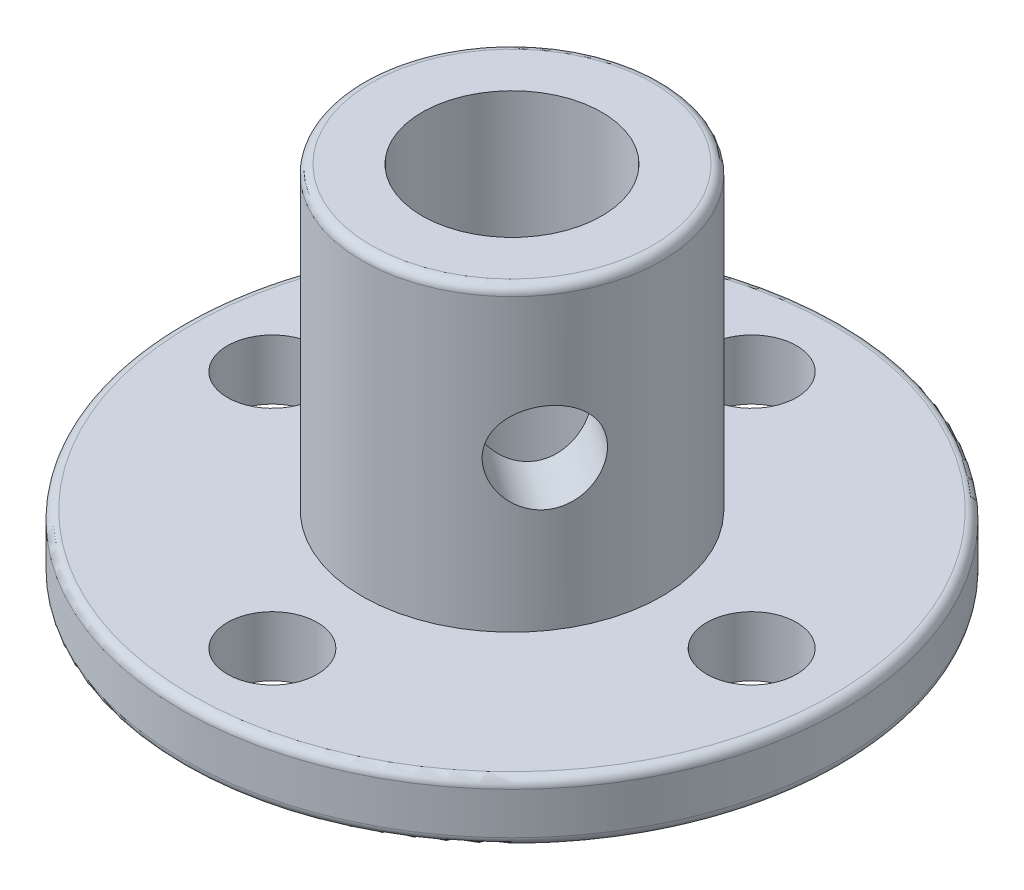
ISO-10303-21;
HEADER;
FILE_DESCRIPTION(('STEP AP214'),'2;1');
FILE_NAME('part.step','',(''),(''),'','','');
FILE_SCHEMA(('AUTOMOTIVE_DESIGN { 1 0 10303 214 1 1 1 1 }'));
ENDSEC;
DATA;
#1=APPLICATION_CONTEXT('core data for automotive mechanical design processes');
#2=APPLICATION_PROTOCOL_DEFINITION('international standard','automotive_design',2000,#1);
#3=PRODUCT_CONTEXT('',#1,'mechanical');
#4=PRODUCT('Part','Part','',(#3));
#5=PRODUCT_RELATED_PRODUCT_CATEGORY('part','',(#4));
#6=PRODUCT_DEFINITION_FORMATION('','',#4);
#7=PRODUCT_DEFINITION_CONTEXT('part definition',#1,'design');
#8=PRODUCT_DEFINITION('design','',#6,#7);
#9=PRODUCT_DEFINITION_SHAPE('','',#8);
#10=(LENGTH_UNIT() NAMED_UNIT(*) SI_UNIT(.MILLI.,.METRE.));
#11=(NAMED_UNIT(*) PLANE_ANGLE_UNIT() SI_UNIT($,.RADIAN.));
#12=(NAMED_UNIT(*) SI_UNIT($,.STERADIAN.) SOLID_ANGLE_UNIT());
#13=UNCERTAINTY_MEASURE_WITH_UNIT(LENGTH_MEASURE(1.E-05),#10,'distance_accuracy_value','');
#14=(GEOMETRIC_REPRESENTATION_CONTEXT(3) GLOBAL_UNCERTAINTY_ASSIGNED_CONTEXT((#13)) GLOBAL_UNIT_ASSIGNED_CONTEXT((#10,
#11,#12)) REPRESENTATION_CONTEXT('',''));
#15=CARTESIAN_POINT('',(0.,0.,0.));
#16=DIRECTION('',(0.,0.,1.));
#17=DIRECTION('',(1.,0.,0.));
#18=AXIS2_PLACEMENT_3D('',#15,#16,#17);
#19=CARTESIAN_POINT('',(0.,12.,0.));
#20=DIRECTION('',(0.,-1.,0.));
#21=DIRECTION('',(0.,0.,-1.));
#22=AXIS2_PLACEMENT_3D('',#19,#20,#21);
#23=CYLINDRICAL_SURFACE('',#22,5.);
#24=CARTESIAN_POINT('',(4.74981979198346,7.,1.56179766413009));
#25=CARTESIAN_POINT('',(4.7498198860034,6.9178054520576,1.56179899148066));
#26=CARTESIAN_POINT('',(4.74761311037452,6.83560077585598,1.56855767470248));
#27=CARTESIAN_POINT('',(4.73871476366398,6.67359475040806,1.59523490105232));
#28=CARTESIAN_POINT('',(4.73202169407674,6.59379421349853,1.61515784125528));
#29=CARTESIAN_POINT('',(4.71396580259608,6.43896527172827,1.6671157969936));
#30=CARTESIAN_POINT('',(4.70261074537588,6.36392917036691,1.69913066601295));
#31=CARTESIAN_POINT('',(4.67494093324864,6.2203780660047,1.7738398944877));
#32=CARTESIAN_POINT('',(4.65862543580988,6.15186404131556,1.81653585263303));
#33=CARTESIAN_POINT('',(4.62016354311629,6.02113360942262,1.91228123009578));
#34=CARTESIAN_POINT('',(4.59786337213556,5.95915410205371,1.9655924121608));
#35=CARTESIAN_POINT('',(4.54736337883399,5.84536204867749,2.07975400963413));
#36=CARTESIAN_POINT('',(4.51916279912231,5.79355080955012,2.14060539251168));
#37=CARTESIAN_POINT('',(4.45607507024332,5.70053730016669,2.26905525111366));
#38=CARTESIAN_POINT('',(4.42106170554921,5.65957657555719,2.33676723102905));
#39=CARTESIAN_POINT('',(4.34492921628019,5.59101274095724,2.47544672562874));
#40=CARTESIAN_POINT('',(4.30381141103157,5.56340675014255,2.54641353457629));
#41=CARTESIAN_POINT('',(4.21737774476952,5.52311999890949,2.68706916872544));
#42=CARTESIAN_POINT('',(4.17221562266321,5.5100348723473,2.75673647850275));
#43=CARTESIAN_POINT('',(4.07783344884419,5.49788267535356,2.8945191625187));
#44=CARTESIAN_POINT('',(4.02861425161109,5.49881266059804,2.96263485971201));
#45=CARTESIAN_POINT('',(3.92925268452518,5.51439286854302,3.09313597611797));
#46=CARTESIAN_POINT('',(3.87918963631798,5.52860519380987,3.15563480300084));
#47=CARTESIAN_POINT('',(3.77834151484289,5.56963133599429,3.27571160892614));
#48=CARTESIAN_POINT('',(3.72755639604793,5.59644595094267,3.33328927606678));
#49=CARTESIAN_POINT('',(3.62647744940709,5.66221202341856,3.44300669382439));
#50=CARTESIAN_POINT('',(3.57619623298301,5.70130120280727,3.49507529756695));
#51=CARTESIAN_POINT('',(3.47862209529838,5.79039785242823,3.59220474198665));
#52=CARTESIAN_POINT('',(3.43132988643211,5.84040791296349,3.63726391576127));
#53=CARTESIAN_POINT('',(3.3398800712971,5.9521977507516,3.72145347087077));
#54=CARTESIAN_POINT('',(3.29591357519374,6.01435691902974,3.76028834834377));
#55=CARTESIAN_POINT('',(3.21526473803641,6.14751001789005,3.82947824723582));
#56=CARTESIAN_POINT('',(3.17858312092933,6.21850482538923,3.85983242599325));
#57=CARTESIAN_POINT('',(3.11410027302203,6.36823946924899,3.91204868534414));
#58=CARTESIAN_POINT('',(3.086387570684,6.44704704586292,3.93382654265679));
#59=CARTESIAN_POINT('',(3.04200348954128,6.60960720844555,3.96825059140881));
#60=CARTESIAN_POINT('',(3.02532850884638,6.69335817153456,3.98089976189336));
#61=CARTESIAN_POINT('',(3.00451404052242,6.86008236073928,3.9966311208788));
#62=CARTESIAN_POINT('',(2.99993048712393,6.94296822389398,4.00005232362724));
#63=CARTESIAN_POINT('',(3.00231176632737,7.10847290000987,3.99826549518246));
#64=CARTESIAN_POINT('',(3.00927498237146,7.19109174873085,3.9930586719205));
#65=CARTESIAN_POINT('',(3.03396504078735,7.35148837797087,3.97432801085477));
#66=CARTESIAN_POINT('',(3.05140755900535,7.42933616426353,3.96102375210047));
#67=CARTESIAN_POINT('',(3.09580233380296,7.58040169081492,3.92642263696043));
#68=CARTESIAN_POINT('',(3.12275605867499,7.65361871414057,3.90512454649467));
#69=CARTESIAN_POINT('',(3.18560655575352,7.79551746407213,3.8540353269966));
#70=CARTESIAN_POINT('',(3.22172394036167,7.86402472098579,3.82403158952298));
#71=CARTESIAN_POINT('',(3.30075952196178,7.9926381061808,3.75602180619148));
#72=CARTESIAN_POINT('',(3.34367934635984,8.05274221761279,3.71801384469722));
#73=CARTESIAN_POINT('',(3.43616698910292,8.16518040581474,3.63274723976687));
#74=CARTESIAN_POINT('',(3.48592457329904,8.21713562898698,3.5851936076426));
#75=CARTESIAN_POINT('',(3.58859032033034,8.30896670102775,3.4824254413391));
#76=CARTESIAN_POINT('',(3.64149832654548,8.34884314978146,3.42721128781378));
#77=CARTESIAN_POINT('',(3.74787820699985,8.4150000305683,3.3105268274446));
#78=CARTESIAN_POINT('',(3.80134268426911,8.44138201615898,3.24910754457441));
#79=CARTESIAN_POINT('',(3.90713801311733,8.48006091889042,3.12108282501145));
#80=CARTESIAN_POINT('',(3.95946918483369,8.49236186594842,3.0544788779725));
#81=CARTESIAN_POINT('',(4.05916272311246,8.5022230440545,2.92059875528922));
#82=CARTESIAN_POINT('',(4.10663883003786,8.50033269540783,2.85344724127037));
#83=CARTESIAN_POINT('',(4.1974628745514,8.48317836750088,2.71807812258277));
#84=CARTESIAN_POINT('',(4.24081104605043,8.46791514651956,2.64986057857629));
#85=CARTESIAN_POINT('',(4.32200535123502,8.42478833860037,2.51523147475257));
#86=CARTESIAN_POINT('',(4.35990556933865,8.39706181935099,2.44880838794386));
#87=CARTESIAN_POINT('',(4.43027713418244,8.32991808549281,2.31907248743974));
#88=CARTESIAN_POINT('',(4.4627475874061,8.29049894971381,2.25576018686022));
#89=CARTESIAN_POINT('',(4.52308013041892,8.19962654256996,2.13228096809081));
#90=CARTESIAN_POINT('',(4.55076152106797,8.14782856999923,2.07227951430628));
#91=CARTESIAN_POINT('',(4.6003493598831,8.0342896116672,1.95973854728669));
#92=CARTESIAN_POINT('',(4.62225413993366,7.97254576210185,1.90720119147979));
#93=CARTESIAN_POINT('',(4.66115320262134,7.83865922168949,1.81010304940294));
#94=CARTESIAN_POINT('',(4.67798167257045,7.76626144660956,1.76582666939937));
#95=CARTESIAN_POINT('',(4.70619188731925,7.61444482583898,1.68921118961477));
#96=CARTESIAN_POINT('',(4.71757624991194,7.53502937639881,1.65686635427766));
#97=CARTESIAN_POINT('',(4.73427994530234,7.38025956839373,1.60847021446135));
#98=CARTESIAN_POINT('',(4.74012108377458,7.30539135306901,1.59103758954651));
#99=CARTESIAN_POINT('',(4.74789057095865,7.15368477750423,1.56770184956096));
#100=CARTESIAN_POINT('',(4.74981970408063,7.07684681535475,1.56179642313946));
#101=CARTESIAN_POINT('',(4.74981979198346,7.,1.56179766413009));
#102=B_SPLINE_CURVE_WITH_KNOTS('',3,(#24,#25,#26,#27,#28,#29,#30,#31,#32,#33,#34,#35,#36,#37,
#38,#39,#40,#41,#42,#43,#44,#45,#46,#47,#48,#49,#50,#51,#52,#53,#54,#55,#56,#57,#58,#59,#60,#61,
#62,#63,#64,#65,#66,#67,#68,#69,#70,#71,#72,#73,#74,#75,#76,#77,#78,#79,#80,#81,#82,#83,#84,#85,
#86,#87,#88,#89,#90,#91,#92,#93,#94,#95,#96,#97,#98,#99,#100,#101),.UNSPECIFIED.,.T.,.F.,(4,2,2,
2,2,2,2,2,2,2,2,2,2,2,2,2,2,2,2,2,2,2,2,2,2,2,2,2,2,2,2,2,2,2,2,2,2,2,4),(0.,0.246300165915543,
0.492682641689001,0.738656414466194,0.984667025370102,1.23773150007984,1.49082847871273,
1.74915939273645,2.00743455587877,2.25832140149558,2.50915554101441,2.7520012599088,
2.99486235890376,3.24055209335676,3.48630016590831,3.74152147023278,3.99676812491863,
4.25446238246267,4.51207250628411,4.76008080790309,5.00805439107388,5.24958594938817,
5.49115481045788,5.73920731809389,5.98731925928923,6.24479506100602,6.50225807324202,
6.75775391814325,7.01317662321682,7.2587630391122,7.50433553047755,7.74727096872219,
7.99024634491378,8.24099627054488,8.49181852629891,8.75011639669147,9.00828993963944,
9.23861153857448,9.4688869503356),.UNSPECIFIED.);
#103=CARTESIAN_POINT('',(4.74981979198346,7.,1.56179766413009));
#104=VERTEX_POINT('',#103);
#105=EDGE_CURVE('E92',#104,#104,#102,.T.);
#106=ORIENTED_EDGE('',*,*,#105,.T.);
#107=EDGE_LOOP('',(#106));
#108=FACE_BOUND('',#107,.T.);
#109=CARTESIAN_POINT('',(0.,11.7,0.));
#110=DIRECTION('',(0.,1.,0.));
#111=DIRECTION('',(0.,0.,1.));
#112=AXIS2_PLACEMENT_3D('',#109,#110,#111);
#113=CIRCLE('',#112,5.);
#114=CARTESIAN_POINT('',(0.,11.7,5.));
#115=VERTEX_POINT('',#114);
#116=EDGE_CURVE('E66',#115,#115,#113,.F.);
#117=ORIENTED_EDGE('',*,*,#116,.T.);
#118=EDGE_LOOP('',(#117));
#119=FACE_BOUND('',#118,.T.);
#120=CARTESIAN_POINT('',(0.,2.,0.));
#121=DIRECTION('',(0.,1.,0.));
#122=DIRECTION('',(0.,0.,1.));
#123=AXIS2_PLACEMENT_3D('',#120,#121,#122);
#124=CIRCLE('',#123,5.);
#125=CARTESIAN_POINT('',(0.,2.,5.));
#126=VERTEX_POINT('',#125);
#127=EDGE_CURVE('E74',#126,#126,#124,.T.);
#128=ORIENTED_EDGE('',*,*,#127,.T.);
#129=EDGE_LOOP('',(#128));
#130=FACE_BOUND('',#129,.T.);
#131=ADVANCED_FACE('F37',(#108,#119,#130),#23,.T.);
#132=CARTESIAN_POINT('',(0.,12.,0.));
#133=DIRECTION('',(0.,1.,0.));
#134=DIRECTION('',(0.,0.,1.));
#135=AXIS2_PLACEMENT_3D('',#132,#133,#134);
#136=PLANE('',#135);
#137=CARTESIAN_POINT('',(0.,12.,0.));
#138=DIRECTION('',(0.,1.,0.));
#139=DIRECTION('',(0.,0.,1.));
#140=AXIS2_PLACEMENT_3D('',#137,#138,#139);
#141=CIRCLE('',#140,4.7);
#142=CARTESIAN_POINT('',(0.,12.,4.7));
#143=VERTEX_POINT('',#142);
#144=EDGE_CURVE('E70',#143,#143,#141,.T.);
#145=ORIENTED_EDGE('',*,*,#144,.T.);
#146=EDGE_LOOP('',(#145));
#147=FACE_BOUND('',#146,.T.);
#148=CARTESIAN_POINT('',(0.,12.,0.));
#149=DIRECTION('',(0.,1.,0.));
#150=DIRECTION('',(0.,0.,1.));
#151=AXIS2_PLACEMENT_3D('',#148,#149,#150);
#152=CIRCLE('',#151,3.);
#153=CARTESIAN_POINT('',(0.,12.,3.));
#154=VERTEX_POINT('',#153);
#155=EDGE_CURVE('E78',#154,#154,#152,.T.);
#156=ORIENTED_EDGE('',*,*,#155,.F.);
#157=EDGE_LOOP('',(#156));
#158=FACE_BOUND('',#157,.T.);
#159=ADVANCED_FACE('F162',(#147,#158),#136,.T.);
#160=CARTESIAN_POINT('',(0.,2.,0.));
#161=DIRECTION('',(0.,-1.,0.));
#162=DIRECTION('',(0.,0.,-1.));
#163=AXIS2_PLACEMENT_3D('',#160,#161,#162);
#164=CYLINDRICAL_SURFACE('',#163,11.);
#165=CARTESIAN_POINT('',(0.,0.3,0.));
#166=DIRECTION('',(0.,1.,0.));
#167=DIRECTION('',(0.,0.,1.));
#168=AXIS2_PLACEMENT_3D('',#165,#166,#167);
#169=CIRCLE('',#168,11.);
#170=CARTESIAN_POINT('',(0.,0.3,11.));
#171=VERTEX_POINT('',#170);
#172=EDGE_CURVE('E56',#171,#171,#169,.T.);
#173=ORIENTED_EDGE('',*,*,#172,.T.);
#174=EDGE_LOOP('',(#173));
#175=FACE_BOUND('',#174,.T.);
#176=CARTESIAN_POINT('',(0.,1.7,0.));
#177=DIRECTION('',(0.,1.,0.));
#178=DIRECTION('',(0.,0.,1.));
#179=AXIS2_PLACEMENT_3D('',#176,#177,#178);
#180=CIRCLE('',#179,11.);
#181=CARTESIAN_POINT('',(0.,1.7,11.));
#182=VERTEX_POINT('',#181);
#183=EDGE_CURVE('E62',#182,#182,#180,.F.);
#184=ORIENTED_EDGE('',*,*,#183,.T.);
#185=EDGE_LOOP('',(#184));
#186=FACE_BOUND('',#185,.T.);
#187=ADVANCED_FACE('F159',(#175,#186),#164,.T.);
#188=CARTESIAN_POINT('',(0.,2.,0.));
#189=DIRECTION('',(0.,1.,0.));
#190=DIRECTION('',(0.,0.,1.));
#191=AXIS2_PLACEMENT_3D('',#188,#189,#190);
#192=PLANE('',#191);
#193=CARTESIAN_POINT('',(0.,2.,0.));
#194=DIRECTION('',(0.,1.,0.));
#195=DIRECTION('',(0.,0.,1.));
#196=AXIS2_PLACEMENT_3D('',#193,#194,#195);
#197=CIRCLE('',#196,10.7);
#198=CARTESIAN_POINT('',(0.,2.,10.7));
#199=VERTEX_POINT('',#198);
#200=EDGE_CURVE('E10',#199,#199,#197,.T.);
#201=ORIENTED_EDGE('',*,*,#200,.T.);
#202=EDGE_LOOP('',(#201));
#203=FACE_BOUND('',#202,.T.);
#204=CARTESIAN_POINT('',(0.,2.,-8.));
#205=DIRECTION('',(0.,1.,0.));
#206=DIRECTION('',(0.,0.,1.));
#207=AXIS2_PLACEMENT_3D('',#204,#205,#206);
#208=CIRCLE('',#207,1.5);
#209=CARTESIAN_POINT('',(0.,2.,-6.5));
#210=VERTEX_POINT('',#209);
#211=EDGE_CURVE('E112',#210,#210,#208,.T.);
#212=ORIENTED_EDGE('',*,*,#211,.F.);
#213=EDGE_LOOP('',(#212));
#214=FACE_BOUND('',#213,.T.);
#215=CARTESIAN_POINT('',(8.00000000000023,2.,-2.25904099284255E-13));
#216=DIRECTION('',(0.,1.,0.));
#217=DIRECTION('',(0.,0.,1.));
#218=AXIS2_PLACEMENT_3D('',#215,#216,#217);
#219=CIRCLE('',#218,1.50000000000018);
#220=CARTESIAN_POINT('',(8.00000000000023,2.,1.49999999999995));
#221=VERTEX_POINT('',#220);
#222=EDGE_CURVE('E104',#221,#221,#219,.T.);
#223=ORIENTED_EDGE('',*,*,#222,.F.);
#224=EDGE_LOOP('',(#223));
#225=FACE_BOUND('',#224,.T.);
#226=CARTESIAN_POINT('',(4.51808198568511E-13,2.,8.));
#227=DIRECTION('',(0.,1.,0.));
#228=DIRECTION('',(0.,0.,1.));
#229=AXIS2_PLACEMENT_3D('',#226,#227,#228);
#230=CIRCLE('',#229,1.50000000000049);
#231=CARTESIAN_POINT('',(4.51808198568511E-13,2.,9.50000000000048));
#232=VERTEX_POINT('',#231);
#233=EDGE_CURVE('E96',#232,#232,#230,.T.);
#234=ORIENTED_EDGE('',*,*,#233,.F.);
#235=EDGE_LOOP('',(#234));
#236=FACE_BOUND('',#235,.T.);
#237=CARTESIAN_POINT('',(-7.99999999999977,2.,2.26883816723573E-13));
#238=DIRECTION('',(0.,1.,0.));
#239=DIRECTION('',(0.,0.,1.));
#240=AXIS2_PLACEMENT_3D('',#237,#238,#239);
#241=CIRCLE('',#240,1.50000000000036);
#242=CARTESIAN_POINT('',(-7.99999999999977,2.,1.50000000000059));
#243=VERTEX_POINT('',#242);
#244=EDGE_CURVE('E87',#243,#243,#241,.T.);
#245=ORIENTED_EDGE('',*,*,#244,.F.);
#246=EDGE_LOOP('',(#245));
#247=FACE_BOUND('',#246,.T.);
#248=ORIENTED_EDGE('',*,*,#127,.F.);
#249=EDGE_LOOP('',(#248));
#250=FACE_BOUND('',#249,.T.);
#251=ADVANCED_FACE('F156',(#203,#214,#225,#236,#247,#250),#192,.T.);
#252=CARTESIAN_POINT('',(0.,0.,0.));
#253=DIRECTION('',(0.,1.,0.));
#254=DIRECTION('',(0.,0.,1.));
#255=AXIS2_PLACEMENT_3D('',#252,#253,#254);
#256=PLANE('',#255);
#257=CARTESIAN_POINT('',(0.,0.,0.));
#258=DIRECTION('',(0.,1.,0.));
#259=DIRECTION('',(0.,0.,1.));
#260=AXIS2_PLACEMENT_3D('',#257,#258,#259);
#261=CIRCLE('',#260,10.7);
#262=CARTESIAN_POINT('',(0.,0.,10.7));
#263=VERTEX_POINT('',#262);
#264=EDGE_CURVE('E51',#263,#263,#261,.F.);
#265=ORIENTED_EDGE('',*,*,#264,.T.);
#266=EDGE_LOOP('',(#265));
#267=FACE_BOUND('',#266,.T.);
#268=CARTESIAN_POINT('',(0.,0.,-8.));
#269=DIRECTION('',(0.,1.,0.));
#270=DIRECTION('',(0.,0.,1.));
#271=AXIS2_PLACEMENT_3D('',#268,#269,#270);
#272=CIRCLE('',#271,1.5);
#273=CARTESIAN_POINT('',(0.,0.,-6.5));
#274=VERTEX_POINT('',#273);
#275=EDGE_CURVE('E83',#274,#274,#272,.T.);
#276=ORIENTED_EDGE('',*,*,#275,.T.);
#277=EDGE_LOOP('',(#276));
#278=FACE_BOUND('',#277,.T.);
#279=CARTESIAN_POINT('',(8.00000000000023,0.,-2.25904099284255E-13));
#280=DIRECTION('',(0.,1.,0.));
#281=DIRECTION('',(0.,0.,1.));
#282=AXIS2_PLACEMENT_3D('',#279,#280,#281);
#283=CIRCLE('',#282,1.50000000000018);
#284=CARTESIAN_POINT('',(8.00000000000023,0.,1.49999999999995));
#285=VERTEX_POINT('',#284);
#286=EDGE_CURVE('E108',#285,#285,#283,.T.);
#287=ORIENTED_EDGE('',*,*,#286,.T.);
#288=EDGE_LOOP('',(#287));
#289=FACE_BOUND('',#288,.T.);
#290=CARTESIAN_POINT('',(4.51808198568511E-13,0.,8.));
#291=DIRECTION('',(0.,1.,0.));
#292=DIRECTION('',(0.,0.,1.));
#293=AXIS2_PLACEMENT_3D('',#290,#291,#292);
#294=CIRCLE('',#293,1.50000000000049);
#295=CARTESIAN_POINT('',(4.51808198568511E-13,0.,9.50000000000048));
#296=VERTEX_POINT('',#295);
#297=EDGE_CURVE('E100',#296,#296,#294,.T.);
#298=ORIENTED_EDGE('',*,*,#297,.T.);
#299=EDGE_LOOP('',(#298));
#300=FACE_BOUND('',#299,.T.);
#301=CARTESIAN_POINT('',(-7.99999999999977,0.,2.26883816723573E-13));
#302=DIRECTION('',(0.,1.,0.));
#303=DIRECTION('',(0.,0.,1.));
#304=AXIS2_PLACEMENT_3D('',#301,#302,#303);
#305=CIRCLE('',#304,1.50000000000036);
#306=CARTESIAN_POINT('',(-7.99999999999977,0.,1.50000000000059));
#307=VERTEX_POINT('',#306);
#308=EDGE_CURVE('E91',#307,#307,#305,.T.);
#309=ORIENTED_EDGE('',*,*,#308,.T.);
#310=EDGE_LOOP('',(#309));
#311=FACE_BOUND('',#310,.T.);
#312=CARTESIAN_POINT('',(0.,0.,0.));
#313=DIRECTION('',(0.,1.,0.));
#314=DIRECTION('',(0.,0.,1.));
#315=AXIS2_PLACEMENT_3D('',#312,#313,#314);
#316=CIRCLE('',#315,3.);
#317=CARTESIAN_POINT('',(0.,0.,3.));
#318=VERTEX_POINT('',#317);
#319=EDGE_CURVE('E79',#318,#318,#316,.T.);
#320=ORIENTED_EDGE('',*,*,#319,.T.);
#321=EDGE_LOOP('',(#320));
#322=FACE_BOUND('',#321,.T.);
#323=ADVANCED_FACE('F154',(#267,#278,#289,#300,#311,#322),#256,.F.);
#324=CARTESIAN_POINT('',(0.,12.,0.));
#325=DIRECTION('',(0.,-1.,0.));
#326=DIRECTION('',(0.,0.,-1.));
#327=AXIS2_PLACEMENT_3D('',#324,#325,#326);
#328=CYLINDRICAL_SURFACE('',#327,3.);
#329=CARTESIAN_POINT('',(2.98537870795165,7.,0.295827602006499));
#330=CARTESIAN_POINT('',(2.98538106045058,6.92183828770712,0.295836004226531));
#331=CARTESIAN_POINT('',(2.98470287628724,6.84357788271243,0.302911983875168));
#332=CARTESIAN_POINT('',(2.98175225480578,6.68945910298427,0.330659729647794));
#333=CARTESIAN_POINT('',(2.97947646684077,6.61360612743489,0.35136006436002));
#334=CARTESIAN_POINT('',(2.97269757298144,6.46682250348409,0.404698331122956));
#335=CARTESIAN_POINT('',(2.96820626814103,6.39586802128962,0.437272777758065));
#336=CARTESIAN_POINT('',(2.95614270862723,6.25986369700492,0.512510997642826));
#337=CARTESIAN_POINT('',(2.94857028726524,6.19481417460631,0.555175316702931));
#338=CARTESIAN_POINT('',(2.92860705293203,6.06654140716374,0.652633162115697));
#339=CARTESIAN_POINT('',(2.9158703411219,6.00391129648968,0.708136851834743));
#340=CARTESIAN_POINT('',(2.88450480231539,5.88788741738994,0.826675252992474));
#341=CARTESIAN_POINT('',(2.86587304930726,5.83449825612472,0.889713694626466));
#342=CARTESIAN_POINT('',(2.8202009096334,5.73494927327851,1.02564102831279));
#343=CARTESIAN_POINT('',(2.79267837777439,5.6895193482107,1.09890748204337));
#344=CARTESIAN_POINT('',(2.7289477964944,5.61228872013136,1.24878168273887));
#345=CARTESIAN_POINT('',(2.6927452510423,5.58047941579424,1.3253872872738));
#346=CARTESIAN_POINT('',(2.6145232316586,5.53374300804835,1.4733515823509));
#347=CARTESIAN_POINT('',(2.57310094956128,5.5177757104667,1.54469576359138));
#348=CARTESIAN_POINT('',(2.48356238258561,5.49975082198744,1.6848794350476));
#349=CARTESIAN_POINT('',(2.4354501660204,5.49768481480643,1.75372041566375));
#350=CARTESIAN_POINT('',(2.33856919326385,5.50712001095552,1.88066937643206));
#351=CARTESIAN_POINT('',(2.29022136290754,5.51745702328183,1.93919011904323));
#352=CARTESIAN_POINT('',(2.19093131619369,5.54932126585699,2.05070595318921));
#353=CARTESIAN_POINT('',(2.13998890595687,5.57084933346433,2.10370063088596));
#354=CARTESIAN_POINT('',(2.03660752833834,5.62462384913472,2.20397198437339));
#355=CARTESIAN_POINT('',(1.98415760679616,5.6570144697581,2.25115940492464));
#356=CARTESIAN_POINT('',(1.88030954877122,5.73139512430224,2.33860024114232));
#357=CARTESIAN_POINT('',(1.82891179603794,5.77338859495352,2.37885116526443));
#358=CARTESIAN_POINT('',(1.72425762148479,5.87034302729952,2.45592094479395));
#359=CARTESIAN_POINT('',(1.67128476545347,5.92615454248901,2.49205571644158));
#360=CARTESIAN_POINT('',(1.57112806761246,6.04688458739527,2.55638553190107));
#361=CARTESIAN_POINT('',(1.52394869001639,6.11181005841109,2.58457447438626));
#362=CARTESIAN_POINT('',(1.43517510441872,6.25397228863613,2.63496540291397));
#363=CARTESIAN_POINT('',(1.39412583834355,6.33172903458132,2.65667351549289));
#364=CARTESIAN_POINT('',(1.32469815011528,6.4944065070385,2.69197080685224));
#365=CARTESIAN_POINT('',(1.29630650985268,6.57931964952634,2.70556846026483));
#366=CARTESIAN_POINT('',(1.25671862196342,6.74682176692419,2.72417046267139));
#367=CARTESIAN_POINT('',(1.24433801052622,6.82906167856533,2.72977040194021));
#368=CARTESIAN_POINT('',(1.23410637448811,6.99460201227481,2.73441420502745));
#369=CARTESIAN_POINT('',(1.23624508643163,7.07790164367968,2.73346269994045));
#370=CARTESIAN_POINT('',(1.25375153220379,7.23348087786809,2.7254677553469));
#371=CARTESIAN_POINT('',(1.26764653745335,7.30596917666189,2.71910210471239));
#372=CARTESIAN_POINT('',(1.30557012143247,7.44755167940644,2.70109678724348));
#373=CARTESIAN_POINT('',(1.32960198180764,7.51664477611991,2.68945541238642));
#374=CARTESIAN_POINT('',(1.38747187866889,7.65311699635404,2.66007832802786));
#375=CARTESIAN_POINT('',(1.42171253960093,7.72026852528033,2.6420853300009));
#376=CARTESIAN_POINT('',(1.49748777017849,7.84820390730849,2.5998865843229));
#377=CARTESIAN_POINT('',(1.53902608482438,7.90898446526993,2.57567764382463));
#378=CARTESIAN_POINT('',(1.63305930683261,8.03046815128532,2.51725039875181));
#379=CARTESIAN_POINT('',(1.68627530929992,8.09019572607649,2.48215504102022));
#380=CARTESIAN_POINT('',(1.7969313840196,8.19911835699039,2.40325908005385));
#381=CARTESIAN_POINT('',(1.85437287434403,8.24830985534581,2.35945554588459));
#382=CARTESIAN_POINT('',(1.97244786412444,8.33586058892515,2.26173981481177));
#383=CARTESIAN_POINT('',(2.03312559690025,8.37389967731636,2.20759134204642));
#384=CARTESIAN_POINT('',(2.15328628415974,8.43570685578609,2.09054262565844));
#385=CARTESIAN_POINT('',(2.21277024322522,8.45948747704946,2.02765012687447));
#386=CARTESIAN_POINT('',(2.32241141573519,8.49005284626199,1.90073261290088));
#387=CARTESIAN_POINT('',(2.37292361400552,8.49819681381417,1.8373409741742));
#388=CARTESIAN_POINT('',(2.46872909384511,8.5012648981816,1.7064421826809));
#389=CARTESIAN_POINT('',(2.51402419656863,8.49619364278534,1.63893647868841));
#390=CARTESIAN_POINT('',(2.5953085111306,8.47387538980656,1.50665495595461));
#391=CARTESIAN_POINT('',(2.63171425470613,8.45745272611349,1.44199236812228));
#392=CARTESIAN_POINT('',(2.69835548270555,8.41400950104554,1.31306781190515));
#393=CARTESIAN_POINT('',(2.7285900813264,8.38698741985982,1.2488059023151));
#394=CARTESIAN_POINT('',(2.78407737356368,8.32190942175104,1.11984486357522));
#395=CARTESIAN_POINT('',(2.80906168095463,8.28343101518824,1.05524458899756));
#396=CARTESIAN_POINT('',(2.85285184071873,8.19706310371142,0.930387622857529));
#397=CARTESIAN_POINT('',(2.87165484471863,8.14916927632649,0.870132943720809));
#398=CARTESIAN_POINT('',(2.90546365022056,8.03980429146594,0.750032668523973));
#399=CARTESIAN_POINT('',(2.91990532332379,7.97745626878421,0.690824563140698));
#400=CARTESIAN_POINT('',(2.94351154594498,7.84382391830535,0.582102233746068));
#401=CARTESIAN_POINT('',(2.95267143671982,7.77253176869847,0.532596593020886));
#402=CARTESIAN_POINT('',(2.96723805287054,7.62004503012857,0.444477549616608));
#403=CARTESIAN_POINT('',(2.97251702328007,7.5386087033069,0.406257802679138));
#404=CARTESIAN_POINT('',(2.98015819320242,7.37000139349033,0.34584431369325));
#405=CARTESIAN_POINT('',(2.98253016479313,7.28285066663097,0.323596984314427));
#406=CARTESIAN_POINT('',(2.98440407235656,7.16229196652201,0.305527680131114));
#407=CARTESIAN_POINT('',(2.98477191740748,7.12994815840318,0.301897887810828));
#408=CARTESIAN_POINT('',(2.98525875374377,7.06507527897664,0.297046018889185));
#409=CARTESIAN_POINT('',(2.98537772838138,7.03254619542119,0.295824103358796));
#410=CARTESIAN_POINT('',(2.98537870795165,7.,0.295827602006499));
#411=B_SPLINE_CURVE_WITH_KNOTS('',3,(#329,#330,#331,#332,#333,#334,#335,#336,#337,#338,#339,
#340,#341,#342,#343,#344,#345,#346,#347,#348,#349,#350,#351,#352,#353,#354,#355,#356,#357,#358,
#359,#360,#361,#362,#363,#364,#365,#366,#367,#368,#369,#370,#371,#372,#373,#374,#375,#376,#377,
#378,#379,#380,#381,#382,#383,#384,#385,#386,#387,#388,#389,#390,#391,#392,#393,#394,#395,#396,
#397,#398,#399,#400,#401,#402,#403,#404,#405,#406,#407,#408,#409,#410),.UNSPECIFIED.,.T.,.F.,(4,
2,2,2,2,2,2,2,2,2,2,2,2,2,2,2,2,2,2,2,2,2,2,2,2,2,2,2,2,2,2,2,2,2,2,2,2,2,2,2,4),(0.,
0.234348183892072,0.469189339237207,0.702792893878328,0.936409088167724,1.18929346874735,
1.44230356626556,1.71236838358145,1.98226240445837,2.23295227451903,2.4834903552906,
2.71224146226808,2.94100968776183,3.1729430209672,3.40495949025408,3.65890787185336,
3.91305072368878,4.18333262594173,4.45333161317557,4.70193436281318,4.9503613978256,
5.17161275136038,5.39293578654095,5.62450944609132,5.85620229330071,6.1171011537092,
6.37808797467304,6.64596272119449,6.91360169713158,7.1566840558423,7.39968130190958,
7.62666637307239,7.8536840026802,8.09041126079208,8.32724745151079,8.58765362775102,
8.84828914267732,9.11716123557908,9.38512699504141,9.48270202777964,9.58028358741811),.UNSPECIFIED.);
#412=CARTESIAN_POINT('',(2.98537870795165,7.,0.295827602006499));
#413=VERTEX_POINT('',#412);
#414=EDGE_CURVE('E41',#413,#413,#411,.T.);
#415=ORIENTED_EDGE('',*,*,#414,.F.);
#416=EDGE_LOOP('',(#415));
#417=FACE_BOUND('',#416,.T.);
#418=ORIENTED_EDGE('',*,*,#155,.T.);
#419=EDGE_LOOP('',(#418));
#420=FACE_BOUND('',#419,.T.);
#421=ORIENTED_EDGE('',*,*,#319,.F.);
#422=EDGE_LOOP('',(#421));
#423=FACE_BOUND('',#422,.T.);
#424=ADVANCED_FACE('F149',(#417,#420,#423),#328,.F.);
#425=CARTESIAN_POINT('',(-7.99999999999977,0.,2.26883816723573E-13));
#426=DIRECTION('',(0.,1.,0.));
#427=DIRECTION('',(0.,0.,1.));
#428=AXIS2_PLACEMENT_3D('',#425,#426,#427);
#429=CYLINDRICAL_SURFACE('',#428,1.50000000000036);
#430=ORIENTED_EDGE('',*,*,#308,.F.);
#431=EDGE_LOOP('',(#430));
#432=FACE_BOUND('',#431,.T.);
#433=ORIENTED_EDGE('',*,*,#244,.T.);
#434=EDGE_LOOP('',(#433));
#435=FACE_BOUND('',#434,.T.);
#436=ADVANCED_FACE('F146',(#432,#435),#429,.F.);
#437=CARTESIAN_POINT('',(4.51808198568511E-13,0.,8.));
#438=DIRECTION('',(0.,1.,0.));
#439=DIRECTION('',(0.,0.,1.));
#440=AXIS2_PLACEMENT_3D('',#437,#438,#439);
#441=CYLINDRICAL_SURFACE('',#440,1.50000000000049);
#442=ORIENTED_EDGE('',*,*,#297,.F.);
#443=EDGE_LOOP('',(#442));
#444=FACE_BOUND('',#443,.T.);
#445=ORIENTED_EDGE('',*,*,#233,.T.);
#446=EDGE_LOOP('',(#445));
#447=FACE_BOUND('',#446,.T.);
#448=ADVANCED_FACE('F142',(#444,#447),#441,.F.);
#449=CARTESIAN_POINT('',(8.00000000000023,0.,-2.25904099284255E-13));
#450=DIRECTION('',(0.,1.,0.));
#451=DIRECTION('',(0.,0.,1.));
#452=AXIS2_PLACEMENT_3D('',#449,#450,#451);
#453=CYLINDRICAL_SURFACE('',#452,1.50000000000018);
#454=ORIENTED_EDGE('',*,*,#286,.F.);
#455=EDGE_LOOP('',(#454));
#456=FACE_BOUND('',#455,.T.);
#457=ORIENTED_EDGE('',*,*,#222,.T.);
#458=EDGE_LOOP('',(#457));
#459=FACE_BOUND('',#458,.T.);
#460=ADVANCED_FACE('F138',(#456,#459),#453,.F.);
#461=CARTESIAN_POINT('',(0.,0.,-8.));
#462=DIRECTION('',(0.,1.,0.));
#463=DIRECTION('',(0.,0.,1.));
#464=AXIS2_PLACEMENT_3D('',#461,#462,#463);
#465=CYLINDRICAL_SURFACE('',#464,1.5);
#466=ORIENTED_EDGE('',*,*,#275,.F.);
#467=EDGE_LOOP('',(#466));
#468=FACE_BOUND('',#467,.T.);
#469=ORIENTED_EDGE('',*,*,#211,.T.);
#470=EDGE_LOOP('',(#469));
#471=FACE_BOUND('',#470,.T.);
#472=ADVANCED_FACE('F133',(#468,#471),#465,.F.);
#473=CARTESIAN_POINT('',(0.,11.7,0.));
#474=DIRECTION('',(0.,1.,0.));
#475=DIRECTION('',(0.,0.,1.));
#476=AXIS2_PLACEMENT_3D('',#473,#474,#475);
#477=TOROIDAL_SURFACE('',#476,4.7,0.3);
#478=ORIENTED_EDGE('',*,*,#116,.F.);
#479=EDGE_LOOP('',(#478));
#480=FACE_BOUND('',#479,.T.);
#481=ORIENTED_EDGE('',*,*,#144,.F.);
#482=EDGE_LOOP('',(#481));
#483=FACE_BOUND('',#482,.T.);
#484=ADVANCED_FACE('F137',(#480,#483),#477,.T.);
#485=CARTESIAN_POINT('',(0.,0.3,0.));
#486=DIRECTION('',(0.,1.,0.));
#487=DIRECTION('',(0.,0.,1.));
#488=AXIS2_PLACEMENT_3D('',#485,#486,#487);
#489=TOROIDAL_SURFACE('',#488,10.7,0.3);
#490=ORIENTED_EDGE('',*,*,#264,.F.);
#491=EDGE_LOOP('',(#490));
#492=FACE_BOUND('',#491,.T.);
#493=ORIENTED_EDGE('',*,*,#172,.F.);
#494=EDGE_LOOP('',(#493));
#495=FACE_BOUND('',#494,.T.);
#496=ADVANCED_FACE('F184',(#492,#495),#489,.T.);
#497=CARTESIAN_POINT('',(0.,1.7,0.));
#498=DIRECTION('',(0.,1.,0.));
#499=DIRECTION('',(0.,0.,1.));
#500=AXIS2_PLACEMENT_3D('',#497,#498,#499);
#501=TOROIDAL_SURFACE('',#500,10.7,0.3);
#502=ORIENTED_EDGE('',*,*,#183,.F.);
#503=EDGE_LOOP('',(#502));
#504=FACE_BOUND('',#503,.T.);
#505=ORIENTED_EDGE('',*,*,#200,.F.);
#506=EDGE_LOOP('',(#505));
#507=FACE_BOUND('',#506,.T.);
#508=ADVANCED_FACE('F39',(#504,#507),#501,.T.);
#509=CARTESIAN_POINT('',(0.812500000000017,7.,0.582961190818029));
#510=DIRECTION('',(0.812500000000016,0.,0.582961190818029));
#511=DIRECTION('',(0.582961190818029,0.,-0.812500000000016));
#512=AXIS2_PLACEMENT_3D('',#509,#510,#511);
#513=CYLINDRICAL_SURFACE('',#512,1.5);
#514=ORIENTED_EDGE('',*,*,#414,.T.);
#515=EDGE_LOOP('',(#514));
#516=FACE_BOUND('',#515,.T.);
#517=ORIENTED_EDGE('',*,*,#105,.F.);
#518=EDGE_LOOP('',(#517));
#519=FACE_BOUND('',#518,.T.);
#520=ADVANCED_FACE('F128',(#516,#519),#513,.F.);
#521=CLOSED_SHELL('',(#131,#159,#187,#251,#323,#424,#436,#448,#460,#472,#484,#496,#508,#520));
#522=MANIFOLD_SOLID_BREP('B2',#521);
#523=ADVANCED_BREP_SHAPE_REPRESENTATION('',(#18,#522),#14);
#524=SHAPE_DEFINITION_REPRESENTATION(#9,#523);
ENDSEC;
END-ISO-10303-21;
